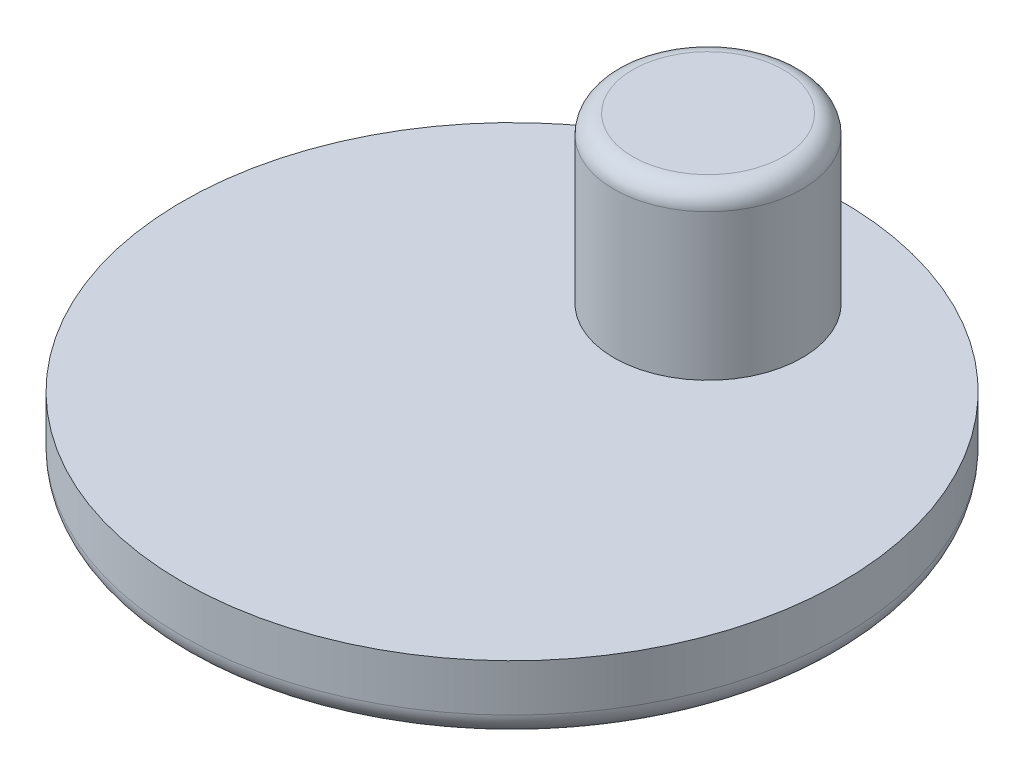
ISO-10303-21;
HEADER;
FILE_DESCRIPTION(('STEP AP214'),'2;1');
FILE_NAME('part.step','',(''),(''),'','','');
FILE_SCHEMA(('AUTOMOTIVE_DESIGN { 1 0 10303 214 1 1 1 1 }'));
ENDSEC;
DATA;
#1=APPLICATION_CONTEXT('core data for automotive mechanical design processes');
#2=APPLICATION_PROTOCOL_DEFINITION('international standard','automotive_design',2000,#1);
#3=PRODUCT_CONTEXT('',#1,'mechanical');
#4=PRODUCT('Part','Part','',(#3));
#5=PRODUCT_RELATED_PRODUCT_CATEGORY('part','',(#4));
#6=PRODUCT_DEFINITION_FORMATION('','',#4);
#7=PRODUCT_DEFINITION_CONTEXT('part definition',#1,'design');
#8=PRODUCT_DEFINITION('design','',#6,#7);
#9=PRODUCT_DEFINITION_SHAPE('','',#8);
#10=(LENGTH_UNIT() NAMED_UNIT(*) SI_UNIT(.MILLI.,.METRE.));
#11=(NAMED_UNIT(*) PLANE_ANGLE_UNIT() SI_UNIT($,.RADIAN.));
#12=(NAMED_UNIT(*) SI_UNIT($,.STERADIAN.) SOLID_ANGLE_UNIT());
#13=UNCERTAINTY_MEASURE_WITH_UNIT(LENGTH_MEASURE(1.E-05),#10,'distance_accuracy_value','');
#14=(GEOMETRIC_REPRESENTATION_CONTEXT(3) GLOBAL_UNCERTAINTY_ASSIGNED_CONTEXT((#13)) GLOBAL_UNIT_ASSIGNED_CONTEXT((#10,
#11,#12)) REPRESENTATION_CONTEXT('',''));
#15=CARTESIAN_POINT('',(0.,0.,0.));
#16=DIRECTION('',(0.,0.,1.));
#17=DIRECTION('',(1.,0.,0.));
#18=AXIS2_PLACEMENT_3D('',#15,#16,#17);
#19=CARTESIAN_POINT('',(0.,0.5,0.));
#20=DIRECTION('',(0.,1.,0.));
#21=DIRECTION('',(0.,0.,1.));
#22=AXIS2_PLACEMENT_3D('',#19,#20,#21);
#23=TOROIDAL_SURFACE('',#22,6.5,0.5);
#24=CARTESIAN_POINT('',(0.,0.,0.));
#25=DIRECTION('',(0.,1.,0.));
#26=DIRECTION('',(0.,0.,1.));
#27=AXIS2_PLACEMENT_3D('',#24,#25,#26);
#28=CIRCLE('',#27,6.5);
#29=CARTESIAN_POINT('',(0.,0.,6.5));
#30=VERTEX_POINT('',#29);
#31=EDGE_CURVE('E43',#30,#30,#28,.F.);
#32=ORIENTED_EDGE('',*,*,#31,.F.);
#33=EDGE_LOOP('',(#32));
#34=FACE_BOUND('',#33,.T.);
#35=CARTESIAN_POINT('',(0.,0.5,0.));
#36=DIRECTION('',(0.,1.,0.));
#37=DIRECTION('',(0.,0.,1.));
#38=AXIS2_PLACEMENT_3D('',#35,#36,#37);
#39=CIRCLE('',#38,7.);
#40=CARTESIAN_POINT('',(0.,0.5,7.));
#41=VERTEX_POINT('',#40);
#42=EDGE_CURVE('E10',#41,#41,#39,.T.);
#43=ORIENTED_EDGE('',*,*,#42,.F.);
#44=EDGE_LOOP('',(#43));
#45=FACE_BOUND('',#44,.T.);
#46=ADVANCED_FACE('F37',(#34,#45),#23,.T.);
#47=CARTESIAN_POINT('',(0.45849902158021,4.6,-3.70421435008734));
#48=DIRECTION('',(0.,1.,0.));
#49=DIRECTION('',(0.,0.,1.));
#50=AXIS2_PLACEMENT_3D('',#47,#48,#49);
#51=TOROIDAL_SURFACE('',#50,1.6,0.4);
#52=CARTESIAN_POINT('',(0.45849902158021,5.,-3.70421435008734));
#53=DIRECTION('',(0.,1.,0.));
#54=DIRECTION('',(0.,0.,1.));
#55=AXIS2_PLACEMENT_3D('',#52,#53,#54);
#56=CIRCLE('',#55,1.6);
#57=CARTESIAN_POINT('',(0.45849902158021,5.,-2.10421435008734));
#58=VERTEX_POINT('',#57);
#59=EDGE_CURVE('E51',#58,#58,#56,.T.);
#60=ORIENTED_EDGE('',*,*,#59,.F.);
#61=EDGE_LOOP('',(#60));
#62=FACE_BOUND('',#61,.T.);
#63=CARTESIAN_POINT('',(0.45849902158021,4.6,-3.70421435008734));
#64=DIRECTION('',(0.,1.,0.));
#65=DIRECTION('',(0.,0.,1.));
#66=AXIS2_PLACEMENT_3D('',#63,#64,#65);
#67=CIRCLE('',#66,2.);
#68=CARTESIAN_POINT('',(0.45849902158021,4.6,-1.70421435008734));
#69=VERTEX_POINT('',#68);
#70=EDGE_CURVE('E47',#69,#69,#67,.F.);
#71=ORIENTED_EDGE('',*,*,#70,.F.);
#72=EDGE_LOOP('',(#71));
#73=FACE_BOUND('',#72,.T.);
#74=ADVANCED_FACE('F74',(#62,#73),#51,.T.);
#75=CARTESIAN_POINT('',(0.,1.5,0.));
#76=DIRECTION('',(0.,-1.,0.));
#77=DIRECTION('',(0.,0.,-1.));
#78=AXIS2_PLACEMENT_3D('',#75,#76,#77);
#79=CYLINDRICAL_SURFACE('',#78,7.);
#80=ORIENTED_EDGE('',*,*,#42,.T.);
#81=EDGE_LOOP('',(#80));
#82=FACE_BOUND('',#81,.T.);
#83=CARTESIAN_POINT('',(0.,1.5,0.));
#84=DIRECTION('',(0.,1.,0.));
#85=DIRECTION('',(0.,0.,1.));
#86=AXIS2_PLACEMENT_3D('',#83,#84,#85);
#87=CIRCLE('',#86,7.);
#88=CARTESIAN_POINT('',(0.,1.5,7.));
#89=VERTEX_POINT('',#88);
#90=EDGE_CURVE('E56',#89,#89,#87,.T.);
#91=ORIENTED_EDGE('',*,*,#90,.F.);
#92=EDGE_LOOP('',(#91));
#93=FACE_BOUND('',#92,.T.);
#94=ADVANCED_FACE('F69',(#82,#93),#79,.T.);
#95=CARTESIAN_POINT('',(0.,1.5,0.));
#96=DIRECTION('',(0.,1.,0.));
#97=DIRECTION('',(0.,0.,1.));
#98=AXIS2_PLACEMENT_3D('',#95,#96,#97);
#99=PLANE('',#98);
#100=CARTESIAN_POINT('',(0.45849902158021,1.5,-3.70421435008734));
#101=DIRECTION('',(0.,1.,0.));
#102=DIRECTION('',(0.,0.,1.));
#103=AXIS2_PLACEMENT_3D('',#100,#101,#102);
#104=CIRCLE('',#103,2.);
#105=CARTESIAN_POINT('',(0.45849902158021,1.5,-1.70421435008734));
#106=VERTEX_POINT('',#105);
#107=EDGE_CURVE('E59',#106,#106,#104,.T.);
#108=ORIENTED_EDGE('',*,*,#107,.F.);
#109=EDGE_LOOP('',(#108));
#110=FACE_BOUND('',#109,.T.);
#111=ORIENTED_EDGE('',*,*,#90,.T.);
#112=EDGE_LOOP('',(#111));
#113=FACE_BOUND('',#112,.T.);
#114=ADVANCED_FACE('F65',(#110,#113),#99,.T.);
#115=CARTESIAN_POINT('',(0.,0.,0.));
#116=DIRECTION('',(0.,1.,0.));
#117=DIRECTION('',(0.,0.,1.));
#118=AXIS2_PLACEMENT_3D('',#115,#116,#117);
#119=PLANE('',#118);
#120=ORIENTED_EDGE('',*,*,#31,.T.);
#121=EDGE_LOOP('',(#120));
#122=FACE_BOUND('',#121,.T.);
#123=ADVANCED_FACE('F68',(#122),#119,.F.);
#124=CARTESIAN_POINT('',(0.45849902158021,5.,-3.70421435008734));
#125=DIRECTION('',(0.,-1.,0.));
#126=DIRECTION('',(0.,0.,-1.));
#127=AXIS2_PLACEMENT_3D('',#124,#125,#126);
#128=CYLINDRICAL_SURFACE('',#127,2.);
#129=ORIENTED_EDGE('',*,*,#70,.T.);
#130=EDGE_LOOP('',(#129));
#131=FACE_BOUND('',#130,.T.);
#132=ORIENTED_EDGE('',*,*,#107,.T.);
#133=EDGE_LOOP('',(#132));
#134=FACE_BOUND('',#133,.T.);
#135=ADVANCED_FACE('F63',(#131,#134),#128,.T.);
#136=CARTESIAN_POINT('',(0.45849902158021,5.,-3.70421435008734));
#137=DIRECTION('',(0.,1.,0.));
#138=DIRECTION('',(0.,0.,1.));
#139=AXIS2_PLACEMENT_3D('',#136,#137,#138);
#140=PLANE('',#139);
#141=ORIENTED_EDGE('',*,*,#59,.T.);
#142=EDGE_LOOP('',(#141));
#143=FACE_BOUND('',#142,.T.);
#144=ADVANCED_FACE('F104',(#143),#140,.T.);
#145=CLOSED_SHELL('',(#46,#74,#94,#114,#123,#135,#144));
#146=MANIFOLD_SOLID_BREP('B2',#145);
#147=ADVANCED_BREP_SHAPE_REPRESENTATION('',(#18,#146),#14);
#148=SHAPE_DEFINITION_REPRESENTATION(#9,#147);
ENDSEC;
END-ISO-10303-21;
